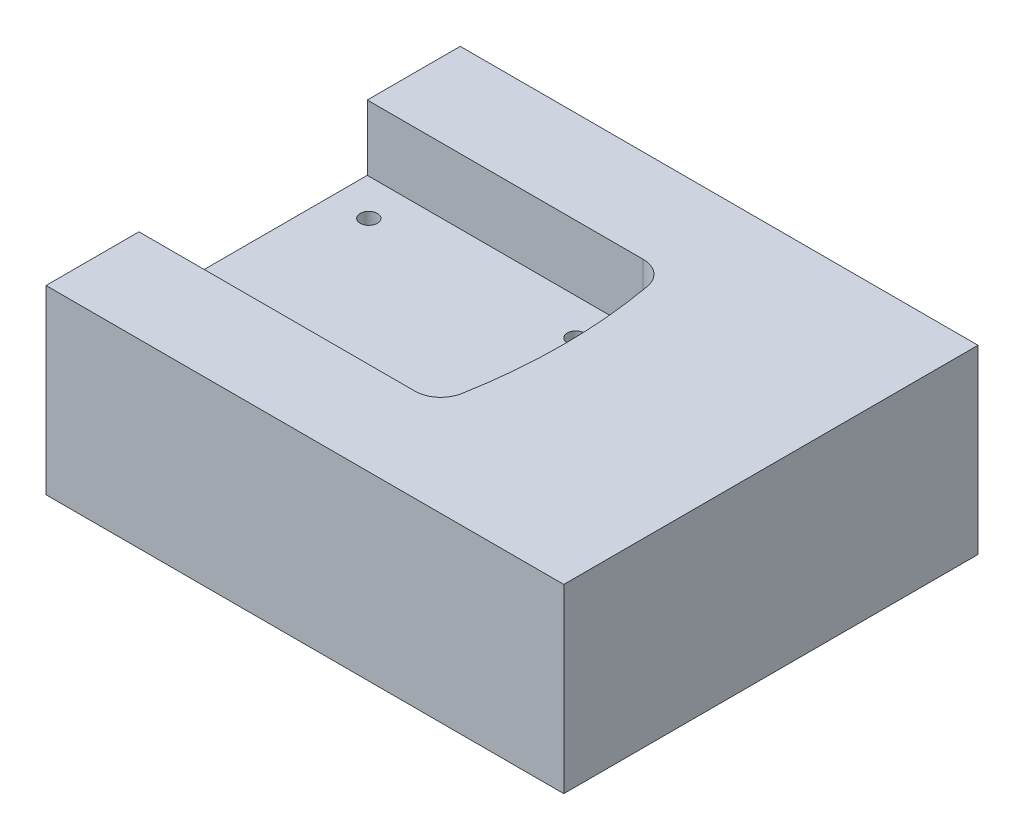
ISO-10303-21;
HEADER;
FILE_DESCRIPTION(('STEP AP214'),'2;1');
FILE_NAME('part.step','',(''),(''),'','','');
FILE_SCHEMA(('AUTOMOTIVE_DESIGN { 1 0 10303 214 1 1 1 1 }'));
ENDSEC;
DATA;
#1=APPLICATION_CONTEXT('core data for automotive mechanical design processes');
#2=APPLICATION_PROTOCOL_DEFINITION('international standard','automotive_design',2000,#1);
#3=PRODUCT_CONTEXT('',#1,'mechanical');
#4=PRODUCT('Part','Part','',(#3));
#5=PRODUCT_RELATED_PRODUCT_CATEGORY('part','',(#4));
#6=PRODUCT_DEFINITION_FORMATION('','',#4);
#7=PRODUCT_DEFINITION_CONTEXT('part definition',#1,'design');
#8=PRODUCT_DEFINITION('design','',#6,#7);
#9=PRODUCT_DEFINITION_SHAPE('','',#8);
#10=(LENGTH_UNIT() NAMED_UNIT(*) SI_UNIT(.MILLI.,.METRE.));
#11=(NAMED_UNIT(*) PLANE_ANGLE_UNIT() SI_UNIT($,.RADIAN.));
#12=(NAMED_UNIT(*) SI_UNIT($,.STERADIAN.) SOLID_ANGLE_UNIT());
#13=UNCERTAINTY_MEASURE_WITH_UNIT(LENGTH_MEASURE(1.E-05),#10,'distance_accuracy_value','');
#14=(GEOMETRIC_REPRESENTATION_CONTEXT(3) GLOBAL_UNCERTAINTY_ASSIGNED_CONTEXT((#13)) GLOBAL_UNIT_ASSIGNED_CONTEXT((#10,
#11,#12)) REPRESENTATION_CONTEXT('',''));
#15=CARTESIAN_POINT('',(0.,0.,0.));
#16=DIRECTION('',(0.,0.,1.));
#17=DIRECTION('',(1.,0.,0.));
#18=AXIS2_PLACEMENT_3D('',#15,#16,#17);
#19=CARTESIAN_POINT('',(63.5,44.45,-50.8));
#20=DIRECTION('',(-1.,0.,0.));
#21=DIRECTION('',(0.,0.,1.));
#22=AXIS2_PLACEMENT_3D('',#19,#20,#21);
#23=PLANE('',#22);
#24=DIRECTION('',(0.,0.,-1.));
#25=VECTOR('',#24,1.);
#26=CARTESIAN_POINT('',(63.5,0.,-50.8));
#27=LINE('',#26,#25);
#28=CARTESIAN_POINT('',(63.5,0.,50.8));
#29=VERTEX_POINT('',#28);
#30=CARTESIAN_POINT('',(63.5,0.,-50.8));
#31=VERTEX_POINT('',#30);
#32=EDGE_CURVE('E155',#29,#31,#27,.T.);
#33=ORIENTED_EDGE('',*,*,#32,.T.);
#34=DIRECTION('',(0.,-1.,0.));
#35=VECTOR('',#34,1.);
#36=CARTESIAN_POINT('',(63.5,44.45,-50.8));
#37=LINE('',#36,#35);
#38=CARTESIAN_POINT('',(63.5,44.45,-50.8));
#39=VERTEX_POINT('',#38);
#40=EDGE_CURVE('E11',#39,#31,#37,.T.);
#41=ORIENTED_EDGE('',*,*,#40,.F.);
#42=DIRECTION('',(0.,0.,-1.));
#43=VECTOR('',#42,1.);
#44=CARTESIAN_POINT('',(63.5,44.45,-50.8));
#45=LINE('',#44,#43);
#46=CARTESIAN_POINT('',(63.5,44.45,50.8));
#47=VERTEX_POINT('',#46);
#48=EDGE_CURVE('E147',#47,#39,#45,.T.);
#49=ORIENTED_EDGE('',*,*,#48,.F.);
#50=DIRECTION('',(0.,-1.,0.));
#51=VECTOR('',#50,1.);
#52=CARTESIAN_POINT('',(63.5,44.45,50.8));
#53=LINE('',#52,#51);
#54=EDGE_CURVE('E154',#47,#29,#53,.T.);
#55=ORIENTED_EDGE('',*,*,#54,.T.);
#56=EDGE_LOOP('',(#33,#41,#49,#55));
#57=FACE_BOUND('',#56,.T.);
#58=ADVANCED_FACE('F32',(#57),#23,.F.);
#59=CARTESIAN_POINT('',(-63.5,44.45,-50.8));
#60=DIRECTION('',(0.,0.,1.));
#61=DIRECTION('',(1.,0.,0.));
#62=AXIS2_PLACEMENT_3D('',#59,#60,#61);
#63=PLANE('',#62);
#64=DIRECTION('',(-1.,0.,0.));
#65=VECTOR('',#64,1.);
#66=CARTESIAN_POINT('',(-63.5,0.,-50.8));
#67=LINE('',#66,#65);
#68=CARTESIAN_POINT('',(-63.5,0.,-50.8));
#69=VERTEX_POINT('',#68);
#70=EDGE_CURVE('E158',#31,#69,#67,.T.);
#71=ORIENTED_EDGE('',*,*,#70,.T.);
#72=DIRECTION('',(0.,-1.,0.));
#73=VECTOR('',#72,1.);
#74=CARTESIAN_POINT('',(-63.5,44.45,-50.8));
#75=LINE('',#74,#73);
#76=CARTESIAN_POINT('',(-63.5,44.45,-50.8));
#77=VERTEX_POINT('',#76);
#78=EDGE_CURVE('E39',#77,#69,#75,.T.);
#79=ORIENTED_EDGE('',*,*,#78,.F.);
#80=DIRECTION('',(-1.,0.,0.));
#81=VECTOR('',#80,1.);
#82=CARTESIAN_POINT('',(-63.5,44.45,-50.8));
#83=LINE('',#82,#81);
#84=EDGE_CURVE('E83',#39,#77,#83,.T.);
#85=ORIENTED_EDGE('',*,*,#84,.F.);
#86=ORIENTED_EDGE('',*,*,#40,.T.);
#87=EDGE_LOOP('',(#71,#79,#85,#86));
#88=FACE_BOUND('',#87,.T.);
#89=ADVANCED_FACE('F184',(#88),#63,.F.);
#90=CARTESIAN_POINT('',(-63.5,44.45,-50.8));
#91=DIRECTION('',(1.,0.,0.));
#92=DIRECTION('',(0.,0.,-1.));
#93=AXIS2_PLACEMENT_3D('',#90,#91,#92);
#94=PLANE('',#93);
#95=DIRECTION('',(0.,0.,1.));
#96=VECTOR('',#95,1.);
#97=CARTESIAN_POINT('',(-63.5,28.45,-28.));
#98=LINE('',#97,#96);
#99=CARTESIAN_POINT('',(-63.5,28.45,-28.));
#100=VERTEX_POINT('',#99);
#101=CARTESIAN_POINT('',(-63.5,28.45,28.));
#102=VERTEX_POINT('',#101);
#103=EDGE_CURVE('E124',#100,#102,#98,.T.);
#104=ORIENTED_EDGE('',*,*,#103,.F.);
#105=DIRECTION('',(0.,1.,0.));
#106=VECTOR('',#105,1.);
#107=CARTESIAN_POINT('',(-63.5,28.45,-28.));
#108=LINE('',#107,#106);
#109=CARTESIAN_POINT('',(-63.5,44.45,-28.));
#110=VERTEX_POINT('',#109);
#111=EDGE_CURVE('E159',#100,#110,#108,.T.);
#112=ORIENTED_EDGE('',*,*,#111,.T.);
#113=DIRECTION('',(0.,0.,1.));
#114=VECTOR('',#113,1.);
#115=CARTESIAN_POINT('',(-63.5,44.45,-50.8));
#116=LINE('',#115,#114);
#117=EDGE_CURVE('E150',#77,#110,#116,.T.);
#118=ORIENTED_EDGE('',*,*,#117,.F.);
#119=ORIENTED_EDGE('',*,*,#78,.T.);
#120=DIRECTION('',(0.,0.,1.));
#121=VECTOR('',#120,1.);
#122=CARTESIAN_POINT('',(-63.5,0.,-50.8));
#123=LINE('',#122,#121);
#124=CARTESIAN_POINT('',(-63.5,0.,50.8));
#125=VERTEX_POINT('',#124);
#126=EDGE_CURVE('E161',#69,#125,#123,.T.);
#127=ORIENTED_EDGE('',*,*,#126,.T.);
#128=DIRECTION('',(0.,-1.,0.));
#129=VECTOR('',#128,1.);
#130=CARTESIAN_POINT('',(-63.5,44.45,50.8));
#131=LINE('',#130,#129);
#132=CARTESIAN_POINT('',(-63.5,44.45,50.8));
#133=VERTEX_POINT('',#132);
#134=EDGE_CURVE('E165',#133,#125,#131,.T.);
#135=ORIENTED_EDGE('',*,*,#134,.F.);
#136=CARTESIAN_POINT('',(-63.5,44.45,28.));
#137=VERTEX_POINT('',#136);
#138=EDGE_CURVE('E139',#137,#133,#116,.T.);
#139=ORIENTED_EDGE('',*,*,#138,.F.);
#140=DIRECTION('',(0.,1.,0.));
#141=VECTOR('',#140,1.);
#142=CARTESIAN_POINT('',(-63.5,28.45,28.));
#143=LINE('',#142,#141);
#144=EDGE_CURVE('E46',#102,#137,#143,.T.);
#145=ORIENTED_EDGE('',*,*,#144,.F.);
#146=EDGE_LOOP('',(#104,#112,#118,#119,#127,#135,#139,#145));
#147=FACE_BOUND('',#146,.T.);
#148=ADVANCED_FACE('F137',(#147),#94,.F.);
#149=CARTESIAN_POINT('',(-63.5,44.45,50.8));
#150=DIRECTION('',(0.,0.,-1.));
#151=DIRECTION('',(-1.,0.,0.));
#152=AXIS2_PLACEMENT_3D('',#149,#150,#151);
#153=PLANE('',#152);
#154=DIRECTION('',(1.,0.,0.));
#155=VECTOR('',#154,1.);
#156=CARTESIAN_POINT('',(-63.5,0.,50.8));
#157=LINE('',#156,#155);
#158=EDGE_CURVE('E76',#125,#29,#157,.T.);
#159=ORIENTED_EDGE('',*,*,#158,.T.);
#160=ORIENTED_EDGE('',*,*,#54,.F.);
#161=DIRECTION('',(1.,0.,0.));
#162=VECTOR('',#161,1.);
#163=CARTESIAN_POINT('',(-63.5,44.45,50.8));
#164=LINE('',#163,#162);
#165=EDGE_CURVE('E55',#133,#47,#164,.T.);
#166=ORIENTED_EDGE('',*,*,#165,.F.);
#167=ORIENTED_EDGE('',*,*,#134,.T.);
#168=EDGE_LOOP('',(#159,#160,#166,#167));
#169=FACE_BOUND('',#168,.T.);
#170=ADVANCED_FACE('F175',(#169),#153,.F.);
#171=CARTESIAN_POINT('',(0.,44.45,0.));
#172=DIRECTION('',(0.,1.,0.));
#173=DIRECTION('',(0.,0.,1.));
#174=AXIS2_PLACEMENT_3D('',#171,#172,#173);
#175=PLANE('',#174);
#176=DIRECTION('',(-1.,0.,0.));
#177=VECTOR('',#176,1.);
#178=CARTESIAN_POINT('',(-63.5,44.45,-28.));
#179=LINE('',#178,#177);
#180=CARTESIAN_POINT('',(4.19161722716566,44.45,-28.));
#181=VERTEX_POINT('',#180);
#182=EDGE_CURVE('E134',#181,#110,#179,.T.);
#183=ORIENTED_EDGE('',*,*,#182,.F.);
#184=CARTESIAN_POINT('',(4.19161722716566,44.45,-21.65));
#185=DIRECTION('',(0.,1.,0.));
#186=DIRECTION('',(0.,0.,-1.));
#187=AXIS2_PLACEMENT_3D('',#184,#185,#186);
#188=CIRCLE('',#187,6.35000000000001);
#189=CARTESIAN_POINT('',(10.4385444496481,44.45,-22.7894736842105));
#190=VERTEX_POINT('',#189);
#191=EDGE_CURVE('E351',#190,#181,#188,.T.);
#192=ORIENTED_EDGE('',*,*,#191,.F.);
#193=CARTESIAN_POINT('',(-114.5,44.45,0.));
#194=DIRECTION('',(0.,1.,0.));
#195=DIRECTION('',(0.,0.,-1.));
#196=AXIS2_PLACEMENT_3D('',#193,#194,#195);
#197=CIRCLE('',#196,127.);
#198=CARTESIAN_POINT('',(10.4385444496481,44.45,22.7894736842105));
#199=VERTEX_POINT('',#198);
#200=EDGE_CURVE('E348',#199,#190,#197,.T.);
#201=ORIENTED_EDGE('',*,*,#200,.F.);
#202=CARTESIAN_POINT('',(4.19161722716566,44.45,21.65));
#203=DIRECTION('',(0.,1.,0.));
#204=DIRECTION('',(0.,0.,1.));
#205=AXIS2_PLACEMENT_3D('',#202,#203,#204);
#206=CIRCLE('',#205,6.35000000000001);
#207=CARTESIAN_POINT('',(4.19161722716566,44.45,28.));
#208=VERTEX_POINT('',#207);
#209=EDGE_CURVE('E345',#208,#199,#206,.T.);
#210=ORIENTED_EDGE('',*,*,#209,.F.);
#211=DIRECTION('',(1.,0.,0.));
#212=VECTOR('',#211,1.);
#213=CARTESIAN_POINT('',(-63.5,44.45,28.));
#214=LINE('',#213,#212);
#215=EDGE_CURVE('E336',#137,#208,#214,.T.);
#216=ORIENTED_EDGE('',*,*,#215,.F.);
#217=ORIENTED_EDGE('',*,*,#138,.T.);
#218=ORIENTED_EDGE('',*,*,#165,.T.);
#219=ORIENTED_EDGE('',*,*,#48,.T.);
#220=ORIENTED_EDGE('',*,*,#84,.T.);
#221=ORIENTED_EDGE('',*,*,#117,.T.);
#222=EDGE_LOOP('',(#183,#192,#201,#210,#216,#217,#218,#219,#220,#221));
#223=FACE_BOUND('',#222,.T.);
#224=ADVANCED_FACE('F177',(#223),#175,.T.);
#225=CARTESIAN_POINT('',(0.,0.,0.));
#226=DIRECTION('',(0.,1.,0.));
#227=DIRECTION('',(0.,0.,1.));
#228=AXIS2_PLACEMENT_3D('',#225,#226,#227);
#229=PLANE('',#228);
#230=CARTESIAN_POINT('',(-54.1749999999999,0.,19.05));
#231=DIRECTION('',(0.,1.,0.));
#232=DIRECTION('',(0.,0.,1.));
#233=AXIS2_PLACEMENT_3D('',#230,#231,#232);
#234=CIRCLE('',#233,2.1082);
#235=CARTESIAN_POINT('',(-54.1749999999999,0.,21.1582));
#236=VERTEX_POINT('',#235);
#237=EDGE_CURVE('E317',#236,#236,#234,.T.);
#238=ORIENTED_EDGE('',*,*,#237,.T.);
#239=EDGE_LOOP('',(#238));
#240=FACE_BOUND('',#239,.T.);
#241=CARTESIAN_POINT('',(-3.37499999999995,0.,-19.05));
#242=DIRECTION('',(0.,1.,0.));
#243=DIRECTION('',(0.,0.,1.));
#244=AXIS2_PLACEMENT_3D('',#241,#242,#243);
#245=CIRCLE('',#244,2.1082);
#246=CARTESIAN_POINT('',(-3.37499999999995,0.,-16.9418));
#247=VERTEX_POINT('',#246);
#248=EDGE_CURVE('E321',#247,#247,#245,.T.);
#249=ORIENTED_EDGE('',*,*,#248,.T.);
#250=EDGE_LOOP('',(#249));
#251=FACE_BOUND('',#250,.T.);
#252=CARTESIAN_POINT('',(-3.37499999999994,0.,19.05));
#253=DIRECTION('',(0.,1.,0.));
#254=DIRECTION('',(0.,0.,1.));
#255=AXIS2_PLACEMENT_3D('',#252,#253,#254);
#256=CIRCLE('',#255,2.1082);
#257=CARTESIAN_POINT('',(-3.37499999999994,0.,21.1582));
#258=VERTEX_POINT('',#257);
#259=EDGE_CURVE('E332',#258,#258,#256,.T.);
#260=ORIENTED_EDGE('',*,*,#259,.T.);
#261=EDGE_LOOP('',(#260));
#262=FACE_BOUND('',#261,.T.);
#263=CARTESIAN_POINT('',(-54.1749999999999,0.,-19.05));
#264=DIRECTION('',(0.,1.,0.));
#265=DIRECTION('',(0.,0.,1.));
#266=AXIS2_PLACEMENT_3D('',#263,#264,#265);
#267=CIRCLE('',#266,2.1082);
#268=CARTESIAN_POINT('',(-54.1749999999999,0.,-16.9418));
#269=VERTEX_POINT('',#268);
#270=EDGE_CURVE('E333',#269,#269,#267,.T.);
#271=ORIENTED_EDGE('',*,*,#270,.T.);
#272=EDGE_LOOP('',(#271));
#273=FACE_BOUND('',#272,.T.);
#274=ORIENTED_EDGE('',*,*,#32,.F.);
#275=ORIENTED_EDGE('',*,*,#158,.F.);
#276=ORIENTED_EDGE('',*,*,#126,.F.);
#277=ORIENTED_EDGE('',*,*,#70,.F.);
#278=EDGE_LOOP('',(#274,#275,#276,#277));
#279=FACE_BOUND('',#278,.T.);
#280=ADVANCED_FACE('F171',(#240,#251,#262,#273,#279),#229,.F.);
#281=CARTESIAN_POINT('',(-63.5,28.45,-28.));
#282=DIRECTION('',(0.,0.,-1.));
#283=DIRECTION('',(-1.,0.,0.));
#284=AXIS2_PLACEMENT_3D('',#281,#282,#283);
#285=PLANE('',#284);
#286=ORIENTED_EDGE('',*,*,#182,.T.);
#287=ORIENTED_EDGE('',*,*,#111,.F.);
#288=DIRECTION('',(-1.,0.,0.));
#289=VECTOR('',#288,1.);
#290=CARTESIAN_POINT('',(-63.5,28.45,-28.));
#291=LINE('',#290,#289);
#292=CARTESIAN_POINT('',(4.19161722716566,28.45,-28.));
#293=VERTEX_POINT('',#292);
#294=EDGE_CURVE('E131',#293,#100,#291,.T.);
#295=ORIENTED_EDGE('',*,*,#294,.F.);
#296=DIRECTION('',(0.,1.,0.));
#297=VECTOR('',#296,1.);
#298=CARTESIAN_POINT('',(4.19161722716566,28.45,-28.));
#299=LINE('',#298,#297);
#300=EDGE_CURVE('E356',#293,#181,#299,.T.);
#301=ORIENTED_EDGE('',*,*,#300,.T.);
#302=EDGE_LOOP('',(#286,#287,#295,#301));
#303=FACE_BOUND('',#302,.T.);
#304=ADVANCED_FACE('F212',(#303),#285,.F.);
#305=CARTESIAN_POINT('',(4.19161722716566,28.45,-21.65));
#306=DIRECTION('',(0.,1.,0.));
#307=DIRECTION('',(0.,0.,1.));
#308=AXIS2_PLACEMENT_3D('',#305,#306,#307);
#309=CYLINDRICAL_SURFACE('',#308,6.35000000000001);
#310=ORIENTED_EDGE('',*,*,#191,.T.);
#311=ORIENTED_EDGE('',*,*,#300,.F.);
#312=CARTESIAN_POINT('',(4.19161722716566,28.45,-21.65));
#313=DIRECTION('',(0.,1.,0.));
#314=DIRECTION('',(0.,0.,-1.));
#315=AXIS2_PLACEMENT_3D('',#312,#313,#314);
#316=CIRCLE('',#315,6.35000000000001);
#317=CARTESIAN_POINT('',(10.4385444496481,28.45,-22.7894736842105));
#318=VERTEX_POINT('',#317);
#319=EDGE_CURVE('E143',#318,#293,#316,.T.);
#320=ORIENTED_EDGE('',*,*,#319,.F.);
#321=DIRECTION('',(0.,1.,0.));
#322=VECTOR('',#321,1.);
#323=CARTESIAN_POINT('',(10.4385444496481,28.45,-22.7894736842105));
#324=LINE('',#323,#322);
#325=EDGE_CURVE('E358',#318,#190,#324,.T.);
#326=ORIENTED_EDGE('',*,*,#325,.T.);
#327=EDGE_LOOP('',(#310,#311,#320,#326));
#328=FACE_BOUND('',#327,.T.);
#329=ADVANCED_FACE('F217',(#328),#309,.F.);
#330=CARTESIAN_POINT('',(-114.5,28.45,0.));
#331=DIRECTION('',(0.,1.,0.));
#332=DIRECTION('',(0.,0.,1.));
#333=AXIS2_PLACEMENT_3D('',#330,#331,#332);
#334=CYLINDRICAL_SURFACE('',#333,127.);
#335=ORIENTED_EDGE('',*,*,#200,.T.);
#336=ORIENTED_EDGE('',*,*,#325,.F.);
#337=CARTESIAN_POINT('',(-114.5,28.45,0.));
#338=DIRECTION('',(0.,1.,0.));
#339=DIRECTION('',(0.,0.,-1.));
#340=AXIS2_PLACEMENT_3D('',#337,#338,#339);
#341=CIRCLE('',#340,127.);
#342=CARTESIAN_POINT('',(10.4385444496481,28.45,22.7894736842105));
#343=VERTEX_POINT('',#342);
#344=EDGE_CURVE('E340',#343,#318,#341,.T.);
#345=ORIENTED_EDGE('',*,*,#344,.F.);
#346=DIRECTION('',(0.,1.,0.));
#347=VECTOR('',#346,1.);
#348=CARTESIAN_POINT('',(10.4385444496481,28.45,22.7894736842105));
#349=LINE('',#348,#347);
#350=EDGE_CURVE('E141',#343,#199,#349,.T.);
#351=ORIENTED_EDGE('',*,*,#350,.T.);
#352=EDGE_LOOP('',(#335,#336,#345,#351));
#353=FACE_BOUND('',#352,.T.);
#354=ADVANCED_FACE('F227',(#353),#334,.F.);
#355=CARTESIAN_POINT('',(4.19161722716566,28.45,21.65));
#356=DIRECTION('',(0.,1.,0.));
#357=DIRECTION('',(0.,0.,1.));
#358=AXIS2_PLACEMENT_3D('',#355,#356,#357);
#359=CYLINDRICAL_SURFACE('',#358,6.35000000000001);
#360=ORIENTED_EDGE('',*,*,#209,.T.);
#361=ORIENTED_EDGE('',*,*,#350,.F.);
#362=CARTESIAN_POINT('',(4.19161722716566,28.45,21.65));
#363=DIRECTION('',(0.,1.,0.));
#364=DIRECTION('',(0.,0.,1.));
#365=AXIS2_PLACEMENT_3D('',#362,#363,#364);
#366=CIRCLE('',#365,6.35000000000001);
#367=CARTESIAN_POINT('',(4.19161722716566,28.45,28.));
#368=VERTEX_POINT('',#367);
#369=EDGE_CURVE('E123',#368,#343,#366,.T.);
#370=ORIENTED_EDGE('',*,*,#369,.F.);
#371=DIRECTION('',(0.,1.,0.));
#372=VECTOR('',#371,1.);
#373=CARTESIAN_POINT('',(4.19161722716566,28.45,28.));
#374=LINE('',#373,#372);
#375=EDGE_CURVE('E119',#368,#208,#374,.T.);
#376=ORIENTED_EDGE('',*,*,#375,.T.);
#377=EDGE_LOOP('',(#360,#361,#370,#376));
#378=FACE_BOUND('',#377,.T.);
#379=ADVANCED_FACE('F237',(#378),#359,.F.);
#380=CARTESIAN_POINT('',(-63.5,28.45,28.));
#381=DIRECTION('',(0.,0.,1.));
#382=DIRECTION('',(1.,0.,0.));
#383=AXIS2_PLACEMENT_3D('',#380,#381,#382);
#384=PLANE('',#383);
#385=ORIENTED_EDGE('',*,*,#215,.T.);
#386=ORIENTED_EDGE('',*,*,#375,.F.);
#387=DIRECTION('',(1.,0.,0.));
#388=VECTOR('',#387,1.);
#389=CARTESIAN_POINT('',(-63.5,28.45,28.));
#390=LINE('',#389,#388);
#391=EDGE_CURVE('E116',#102,#368,#390,.T.);
#392=ORIENTED_EDGE('',*,*,#391,.F.);
#393=ORIENTED_EDGE('',*,*,#144,.T.);
#394=EDGE_LOOP('',(#385,#386,#392,#393));
#395=FACE_BOUND('',#394,.T.);
#396=ADVANCED_FACE('F118',(#395),#384,.F.);
#397=CARTESIAN_POINT('',(4.19161722716566,28.45,21.65));
#398=DIRECTION('',(0.,1.,0.));
#399=DIRECTION('',(0.,0.,1.));
#400=AXIS2_PLACEMENT_3D('',#397,#398,#399);
#401=PLANE('',#400);
#402=CARTESIAN_POINT('',(-54.1749999999999,28.45,19.05));
#403=DIRECTION('',(0.,1.,0.));
#404=DIRECTION('',(0.,0.,1.));
#405=AXIS2_PLACEMENT_3D('',#402,#403,#404);
#406=CIRCLE('',#405,2.1082);
#407=CARTESIAN_POINT('',(-54.1749999999999,28.45,21.1582));
#408=VERTEX_POINT('',#407);
#409=EDGE_CURVE('E320',#408,#408,#406,.T.);
#410=ORIENTED_EDGE('',*,*,#409,.F.);
#411=EDGE_LOOP('',(#410));
#412=FACE_BOUND('',#411,.T.);
#413=CARTESIAN_POINT('',(-3.37499999999995,28.45,-19.05));
#414=DIRECTION('',(0.,1.,0.));
#415=DIRECTION('',(0.,0.,1.));
#416=AXIS2_PLACEMENT_3D('',#413,#414,#415);
#417=CIRCLE('',#416,2.1082);
#418=CARTESIAN_POINT('',(-3.37499999999995,28.45,-16.9418));
#419=VERTEX_POINT('',#418);
#420=EDGE_CURVE('E326',#419,#419,#417,.T.);
#421=ORIENTED_EDGE('',*,*,#420,.F.);
#422=EDGE_LOOP('',(#421));
#423=FACE_BOUND('',#422,.T.);
#424=CARTESIAN_POINT('',(-3.37499999999994,28.45,19.05));
#425=DIRECTION('',(0.,1.,0.));
#426=DIRECTION('',(0.,0.,1.));
#427=AXIS2_PLACEMENT_3D('',#424,#425,#426);
#428=CIRCLE('',#427,2.1082);
#429=CARTESIAN_POINT('',(-3.37499999999994,28.45,21.1582));
#430=VERTEX_POINT('',#429);
#431=EDGE_CURVE('E373',#430,#430,#428,.T.);
#432=ORIENTED_EDGE('',*,*,#431,.F.);
#433=EDGE_LOOP('',(#432));
#434=FACE_BOUND('',#433,.T.);
#435=CARTESIAN_POINT('',(-54.1749999999999,28.45,-19.05));
#436=DIRECTION('',(0.,1.,0.));
#437=DIRECTION('',(0.,0.,1.));
#438=AXIS2_PLACEMENT_3D('',#435,#436,#437);
#439=CIRCLE('',#438,2.1082);
#440=CARTESIAN_POINT('',(-54.1749999999999,28.45,-16.9418));
#441=VERTEX_POINT('',#440);
#442=EDGE_CURVE('E323',#441,#441,#439,.T.);
#443=ORIENTED_EDGE('',*,*,#442,.F.);
#444=EDGE_LOOP('',(#443));
#445=FACE_BOUND('',#444,.T.);
#446=ORIENTED_EDGE('',*,*,#103,.T.);
#447=ORIENTED_EDGE('',*,*,#391,.T.);
#448=ORIENTED_EDGE('',*,*,#369,.T.);
#449=ORIENTED_EDGE('',*,*,#344,.T.);
#450=ORIENTED_EDGE('',*,*,#319,.T.);
#451=ORIENTED_EDGE('',*,*,#294,.T.);
#452=EDGE_LOOP('',(#446,#447,#448,#449,#450,#451));
#453=FACE_BOUND('',#452,.T.);
#454=ADVANCED_FACE('F128',(#412,#423,#434,#445,#453),#401,.T.);
#455=CARTESIAN_POINT('',(-54.1749999999999,0.,-19.05));
#456=DIRECTION('',(0.,1.,0.));
#457=DIRECTION('',(0.,0.,1.));
#458=AXIS2_PLACEMENT_3D('',#455,#456,#457);
#459=CYLINDRICAL_SURFACE('',#458,2.1082);
#460=ORIENTED_EDGE('',*,*,#270,.F.);
#461=EDGE_LOOP('',(#460));
#462=FACE_BOUND('',#461,.T.);
#463=ORIENTED_EDGE('',*,*,#442,.T.);
#464=EDGE_LOOP('',(#463));
#465=FACE_BOUND('',#464,.T.);
#466=ADVANCED_FACE('F270',(#462,#465),#459,.F.);
#467=CARTESIAN_POINT('',(-3.37499999999994,0.,19.05));
#468=DIRECTION('',(0.,1.,0.));
#469=DIRECTION('',(0.,0.,1.));
#470=AXIS2_PLACEMENT_3D('',#467,#468,#469);
#471=CYLINDRICAL_SURFACE('',#470,2.1082);
#472=ORIENTED_EDGE('',*,*,#259,.F.);
#473=EDGE_LOOP('',(#472));
#474=FACE_BOUND('',#473,.T.);
#475=ORIENTED_EDGE('',*,*,#431,.T.);
#476=EDGE_LOOP('',(#475));
#477=FACE_BOUND('',#476,.T.);
#478=ADVANCED_FACE('F280',(#474,#477),#471,.F.);
#479=CARTESIAN_POINT('',(-3.37499999999995,0.,-19.05));
#480=DIRECTION('',(0.,1.,0.));
#481=DIRECTION('',(0.,0.,1.));
#482=AXIS2_PLACEMENT_3D('',#479,#480,#481);
#483=CYLINDRICAL_SURFACE('',#482,2.1082);
#484=ORIENTED_EDGE('',*,*,#248,.F.);
#485=EDGE_LOOP('',(#484));
#486=FACE_BOUND('',#485,.T.);
#487=ORIENTED_EDGE('',*,*,#420,.T.);
#488=EDGE_LOOP('',(#487));
#489=FACE_BOUND('',#488,.T.);
#490=ADVANCED_FACE('F290',(#486,#489),#483,.F.);
#491=CARTESIAN_POINT('',(-54.1749999999999,0.,19.05));
#492=DIRECTION('',(0.,1.,0.));
#493=DIRECTION('',(0.,0.,1.));
#494=AXIS2_PLACEMENT_3D('',#491,#492,#493);
#495=CYLINDRICAL_SURFACE('',#494,2.1082);
#496=ORIENTED_EDGE('',*,*,#237,.F.);
#497=EDGE_LOOP('',(#496));
#498=FACE_BOUND('',#497,.T.);
#499=ORIENTED_EDGE('',*,*,#409,.T.);
#500=EDGE_LOOP('',(#499));
#501=FACE_BOUND('',#500,.T.);
#502=ADVANCED_FACE('F300',(#498,#501),#495,.F.);
#503=CLOSED_SHELL('',(#58,#89,#148,#170,#224,#280,#304,#329,#354,#379,#396,#454,#466,#478,#490,#502));
#504=MANIFOLD_SOLID_BREP('B2',#503);
#505=ADVANCED_BREP_SHAPE_REPRESENTATION('',(#18,#504),#14);
#506=SHAPE_DEFINITION_REPRESENTATION(#9,#505);
ENDSEC;
END-ISO-10303-21;
